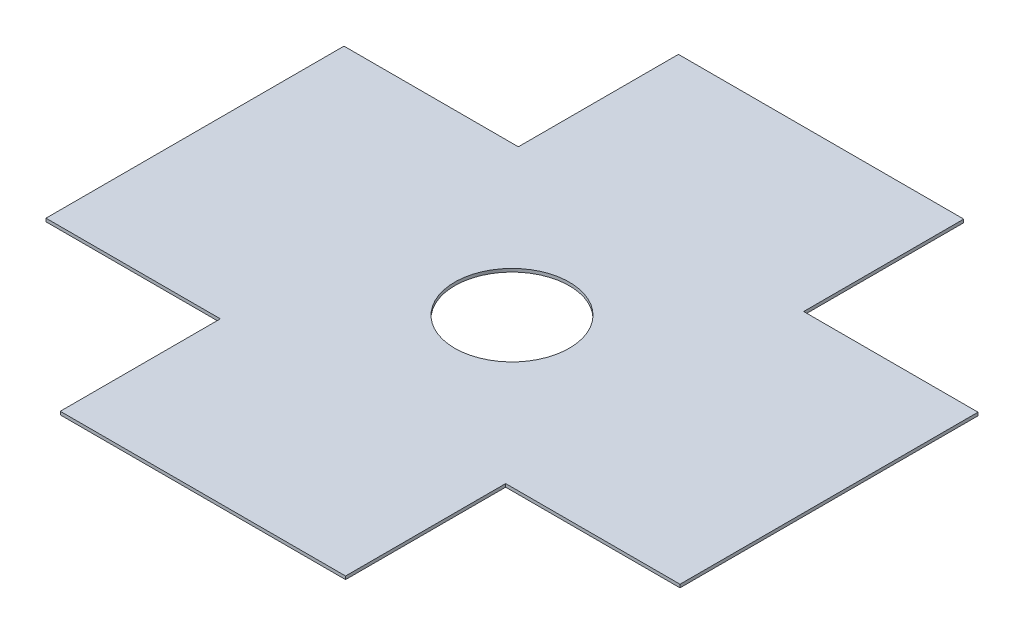
ISO-10303-21;
HEADER;
FILE_DESCRIPTION(('STEP AP214'),'2;1');
FILE_NAME('part.step','',(''),(''),'','','');
FILE_SCHEMA(('AUTOMOTIVE_DESIGN { 1 0 10303 214 1 1 1 1 }'));
ENDSEC;
DATA;
#1=APPLICATION_CONTEXT('core data for automotive mechanical design processes');
#2=APPLICATION_PROTOCOL_DEFINITION('international standard','automotive_design',2000,#1);
#3=PRODUCT_CONTEXT('',#1,'mechanical');
#4=PRODUCT('Part','Part','',(#3));
#5=PRODUCT_RELATED_PRODUCT_CATEGORY('part','',(#4));
#6=PRODUCT_DEFINITION_FORMATION('','',#4);
#7=PRODUCT_DEFINITION_CONTEXT('part definition',#1,'design');
#8=PRODUCT_DEFINITION('design','',#6,#7);
#9=PRODUCT_DEFINITION_SHAPE('','',#8);
#10=(LENGTH_UNIT() NAMED_UNIT(*) SI_UNIT(.MILLI.,.METRE.));
#11=(NAMED_UNIT(*) PLANE_ANGLE_UNIT() SI_UNIT($,.RADIAN.));
#12=(NAMED_UNIT(*) SI_UNIT($,.STERADIAN.) SOLID_ANGLE_UNIT());
#13=UNCERTAINTY_MEASURE_WITH_UNIT(LENGTH_MEASURE(1.E-05),#10,'distance_accuracy_value','');
#14=(GEOMETRIC_REPRESENTATION_CONTEXT(3) GLOBAL_UNCERTAINTY_ASSIGNED_CONTEXT((#13)) GLOBAL_UNIT_ASSIGNED_CONTEXT((#10,
#11,#12)) REPRESENTATION_CONTEXT('',''));
#15=CARTESIAN_POINT('',(0.,0.,0.));
#16=DIRECTION('',(0.,0.,1.));
#17=DIRECTION('',(1.,0.,0.));
#18=AXIS2_PLACEMENT_3D('',#15,#16,#17);
#19=CARTESIAN_POINT('',(279.299936852578,-165.,-376.420908513837));
#20=DIRECTION('',(1.,0.,0.));
#21=DIRECTION('',(0.,1.,0.));
#22=AXIS2_PLACEMENT_3D('',#19,#20,#21);
#23=PLANE('',#22);
#24=DIRECTION('',(0.,0.,1.));
#25=VECTOR('',#24,1.);
#26=CARTESIAN_POINT('',(279.299936852578,-167.,-376.420908513837));
#27=LINE('',#26,#25);
#28=CARTESIAN_POINT('',(279.299936852578,-167.,-376.420908513837));
#29=VERTEX_POINT('',#28);
#30=CARTESIAN_POINT('',(279.299936852578,-167.,-275.420908513837));
#31=VERTEX_POINT('',#30);
#32=EDGE_CURVE('E159',#29,#31,#27,.T.);
#33=ORIENTED_EDGE('',*,*,#32,.F.);
#34=DIRECTION('',(0.,-1.,0.));
#35=VECTOR('',#34,1.);
#36=CARTESIAN_POINT('',(279.299936852578,-165.,-376.420908513837));
#37=LINE('',#36,#35);
#38=CARTESIAN_POINT('',(279.299936852578,-165.,-376.420908513837));
#39=VERTEX_POINT('',#38);
#40=EDGE_CURVE('E52',#39,#29,#37,.T.);
#41=ORIENTED_EDGE('',*,*,#40,.F.);
#42=DIRECTION('',(0.,0.,1.));
#43=VECTOR('',#42,1.);
#44=CARTESIAN_POINT('',(279.299936852578,-165.,-376.420908513837));
#45=LINE('',#44,#43);
#46=CARTESIAN_POINT('',(279.299936852578,-165.,-275.420908513837));
#47=VERTEX_POINT('',#46);
#48=EDGE_CURVE('E193',#39,#47,#45,.T.);
#49=ORIENTED_EDGE('',*,*,#48,.T.);
#50=DIRECTION('',(0.,-1.,0.));
#51=VECTOR('',#50,1.);
#52=CARTESIAN_POINT('',(279.299936852578,-165.,-275.420908513837));
#53=LINE('',#52,#51);
#54=EDGE_CURVE('E105',#47,#31,#53,.T.);
#55=ORIENTED_EDGE('',*,*,#54,.T.);
#56=EDGE_LOOP('',(#33,#41,#49,#55));
#57=FACE_BOUND('',#56,.T.);
#58=ADVANCED_FACE('F36',(#57),#23,.T.);
#59=CARTESIAN_POINT('',(99.2999368525785,-165.,-376.420908513837));
#60=DIRECTION('',(0.,0.,-1.));
#61=DIRECTION('',(-1.,0.,0.));
#62=AXIS2_PLACEMENT_3D('',#59,#60,#61);
#63=PLANE('',#62);
#64=DIRECTION('',(1.,0.,0.));
#65=VECTOR('',#64,1.);
#66=CARTESIAN_POINT('',(99.2999368525785,-167.,-376.420908513837));
#67=LINE('',#66,#65);
#68=CARTESIAN_POINT('',(99.2999368525785,-167.,-376.420908513837));
#69=VERTEX_POINT('',#68);
#70=EDGE_CURVE('E190',#69,#29,#67,.T.);
#71=ORIENTED_EDGE('',*,*,#70,.F.);
#72=DIRECTION('',(0.,-1.,0.));
#73=VECTOR('',#72,1.);
#74=CARTESIAN_POINT('',(99.2999368525785,-165.,-376.420908513837));
#75=LINE('',#74,#73);
#76=CARTESIAN_POINT('',(99.2999368525785,-165.,-376.420908513837));
#77=VERTEX_POINT('',#76);
#78=EDGE_CURVE('E93',#77,#69,#75,.T.);
#79=ORIENTED_EDGE('',*,*,#78,.F.);
#80=DIRECTION('',(1.,0.,0.));
#81=VECTOR('',#80,1.);
#82=CARTESIAN_POINT('',(99.2999368525785,-165.,-376.420908513837));
#83=LINE('',#82,#81);
#84=EDGE_CURVE('E149',#77,#39,#83,.T.);
#85=ORIENTED_EDGE('',*,*,#84,.T.);
#86=ORIENTED_EDGE('',*,*,#40,.T.);
#87=EDGE_LOOP('',(#71,#79,#85,#86));
#88=FACE_BOUND('',#87,.T.);
#89=ADVANCED_FACE('F273',(#88),#63,.T.);
#90=CARTESIAN_POINT('',(99.2999368525785,-165.,-275.420908513837));
#91=DIRECTION('',(-1.,0.,0.));
#92=DIRECTION('',(0.,0.,1.));
#93=AXIS2_PLACEMENT_3D('',#90,#91,#92);
#94=PLANE('',#93);
#95=DIRECTION('',(0.,0.,-1.));
#96=VECTOR('',#95,1.);
#97=CARTESIAN_POINT('',(99.2999368525785,-167.,-275.420908513837));
#98=LINE('',#97,#96);
#99=CARTESIAN_POINT('',(99.2999368525785,-167.,-275.420908513837));
#100=VERTEX_POINT('',#99);
#101=EDGE_CURVE('E136',#100,#69,#98,.T.);
#102=ORIENTED_EDGE('',*,*,#101,.F.);
#103=DIRECTION('',(0.,-1.,0.));
#104=VECTOR('',#103,1.);
#105=CARTESIAN_POINT('',(99.2999368525785,-165.,-275.420908513837));
#106=LINE('',#105,#104);
#107=CARTESIAN_POINT('',(99.2999368525785,-165.,-275.420908513837));
#108=VERTEX_POINT('',#107);
#109=EDGE_CURVE('E131',#108,#100,#106,.T.);
#110=ORIENTED_EDGE('',*,*,#109,.F.);
#111=DIRECTION('',(0.,0.,-1.));
#112=VECTOR('',#111,1.);
#113=CARTESIAN_POINT('',(99.2999368525785,-165.,-275.420908513837));
#114=LINE('',#113,#112);
#115=EDGE_CURVE('E134',#108,#77,#114,.T.);
#116=ORIENTED_EDGE('',*,*,#115,.T.);
#117=ORIENTED_EDGE('',*,*,#78,.T.);
#118=EDGE_LOOP('',(#102,#110,#116,#117));
#119=FACE_BOUND('',#118,.T.);
#120=ADVANCED_FACE('F133',(#119),#94,.T.);
#121=CARTESIAN_POINT('',(-10.7000631474216,-165.,-275.420908513837));
#122=DIRECTION('',(0.,0.,-1.));
#123=DIRECTION('',(-1.,0.,0.));
#124=AXIS2_PLACEMENT_3D('',#121,#122,#123);
#125=PLANE('',#124);
#126=DIRECTION('',(1.,0.,0.));
#127=VECTOR('',#126,1.);
#128=CARTESIAN_POINT('',(-10.7000631474216,-167.,-275.420908513837));
#129=LINE('',#128,#127);
#130=CARTESIAN_POINT('',(-10.7000631474216,-167.,-275.420908513837));
#131=VERTEX_POINT('',#130);
#132=EDGE_CURVE('E187',#131,#100,#129,.T.);
#133=ORIENTED_EDGE('',*,*,#132,.F.);
#134=DIRECTION('',(0.,-1.,0.));
#135=VECTOR('',#134,1.);
#136=CARTESIAN_POINT('',(-10.7000631474216,-165.,-275.420908513837));
#137=LINE('',#136,#135);
#138=CARTESIAN_POINT('',(-10.7000631474216,-165.,-275.420908513837));
#139=VERTEX_POINT('',#138);
#140=EDGE_CURVE('E141',#139,#131,#137,.T.);
#141=ORIENTED_EDGE('',*,*,#140,.F.);
#142=DIRECTION('',(1.,0.,0.));
#143=VECTOR('',#142,1.);
#144=CARTESIAN_POINT('',(-10.7000631474216,-165.,-275.420908513837));
#145=LINE('',#144,#143);
#146=EDGE_CURVE('E147',#139,#108,#145,.T.);
#147=ORIENTED_EDGE('',*,*,#146,.T.);
#148=ORIENTED_EDGE('',*,*,#109,.T.);
#149=EDGE_LOOP('',(#133,#141,#147,#148));
#150=FACE_BOUND('',#149,.T.);
#151=ADVANCED_FACE('F151',(#150),#125,.T.);
#152=CARTESIAN_POINT('',(-10.7000631474216,-165.,-87.4209085138368));
#153=DIRECTION('',(-1.,0.,0.));
#154=DIRECTION('',(0.,-1.,0.));
#155=AXIS2_PLACEMENT_3D('',#152,#153,#154);
#156=PLANE('',#155);
#157=DIRECTION('',(0.,0.,-1.));
#158=VECTOR('',#157,1.);
#159=CARTESIAN_POINT('',(-10.7000631474216,-167.,-87.4209085138368));
#160=LINE('',#159,#158);
#161=CARTESIAN_POINT('',(-10.7000631474216,-167.,-87.4209085138368));
#162=VERTEX_POINT('',#161);
#163=EDGE_CURVE('E184',#162,#131,#160,.T.);
#164=ORIENTED_EDGE('',*,*,#163,.F.);
#165=DIRECTION('',(0.,-1.,0.));
#166=VECTOR('',#165,1.);
#167=CARTESIAN_POINT('',(-10.7000631474216,-165.,-87.4209085138368));
#168=LINE('',#167,#166);
#169=CARTESIAN_POINT('',(-10.7000631474216,-165.,-87.4209085138368));
#170=VERTEX_POINT('',#169);
#171=EDGE_CURVE('E198',#170,#162,#168,.T.);
#172=ORIENTED_EDGE('',*,*,#171,.F.);
#173=DIRECTION('',(0.,0.,-1.));
#174=VECTOR('',#173,1.);
#175=CARTESIAN_POINT('',(-10.7000631474216,-165.,-87.4209085138368));
#176=LINE('',#175,#174);
#177=EDGE_CURVE('E152',#170,#139,#176,.T.);
#178=ORIENTED_EDGE('',*,*,#177,.T.);
#179=ORIENTED_EDGE('',*,*,#140,.T.);
#180=EDGE_LOOP('',(#164,#172,#178,#179));
#181=FACE_BOUND('',#180,.T.);
#182=ADVANCED_FACE('F272',(#181),#156,.T.);
#183=CARTESIAN_POINT('',(99.2999368525785,-165.,-87.4209085138368));
#184=DIRECTION('',(0.,0.,1.));
#185=DIRECTION('',(1.,0.,0.));
#186=AXIS2_PLACEMENT_3D('',#183,#184,#185);
#187=PLANE('',#186);
#188=DIRECTION('',(-1.,0.,0.));
#189=VECTOR('',#188,1.);
#190=CARTESIAN_POINT('',(99.2999368525785,-167.,-87.4209085138368));
#191=LINE('',#190,#189);
#192=CARTESIAN_POINT('',(99.2999368525785,-167.,-87.4209085138368));
#193=VERTEX_POINT('',#192);
#194=EDGE_CURVE('E181',#193,#162,#191,.T.);
#195=ORIENTED_EDGE('',*,*,#194,.F.);
#196=DIRECTION('',(0.,-1.,0.));
#197=VECTOR('',#196,1.);
#198=CARTESIAN_POINT('',(99.2999368525785,-165.,-87.4209085138368));
#199=LINE('',#198,#197);
#200=CARTESIAN_POINT('',(99.2999368525785,-165.,-87.4209085138368));
#201=VERTEX_POINT('',#200);
#202=EDGE_CURVE('E200',#201,#193,#199,.T.);
#203=ORIENTED_EDGE('',*,*,#202,.F.);
#204=DIRECTION('',(-1.,0.,0.));
#205=VECTOR('',#204,1.);
#206=CARTESIAN_POINT('',(99.2999368525785,-165.,-87.4209085138368));
#207=LINE('',#206,#205);
#208=EDGE_CURVE('E154',#201,#170,#207,.T.);
#209=ORIENTED_EDGE('',*,*,#208,.T.);
#210=ORIENTED_EDGE('',*,*,#171,.T.);
#211=EDGE_LOOP('',(#195,#203,#209,#210));
#212=FACE_BOUND('',#211,.T.);
#213=ADVANCED_FACE('F269',(#212),#187,.T.);
#214=CARTESIAN_POINT('',(99.2999368525784,-165.,13.5790914861632));
#215=DIRECTION('',(-1.,0.,0.));
#216=DIRECTION('',(0.,0.,1.));
#217=AXIS2_PLACEMENT_3D('',#214,#215,#216);
#218=PLANE('',#217);
#219=DIRECTION('',(0.,0.,-1.));
#220=VECTOR('',#219,1.);
#221=CARTESIAN_POINT('',(99.2999368525784,-167.,13.5790914861632));
#222=LINE('',#221,#220);
#223=CARTESIAN_POINT('',(99.2999368525784,-167.,13.5790914861632));
#224=VERTEX_POINT('',#223);
#225=EDGE_CURVE('E178',#224,#193,#222,.T.);
#226=ORIENTED_EDGE('',*,*,#225,.F.);
#227=DIRECTION('',(0.,-1.,0.));
#228=VECTOR('',#227,1.);
#229=CARTESIAN_POINT('',(99.2999368525784,-165.,13.5790914861632));
#230=LINE('',#229,#228);
#231=CARTESIAN_POINT('',(99.2999368525784,-165.,13.5790914861632));
#232=VERTEX_POINT('',#231);
#233=EDGE_CURVE('E202',#232,#224,#230,.T.);
#234=ORIENTED_EDGE('',*,*,#233,.F.);
#235=DIRECTION('',(0.,0.,-1.));
#236=VECTOR('',#235,1.);
#237=CARTESIAN_POINT('',(99.2999368525784,-165.,13.5790914861632));
#238=LINE('',#237,#236);
#239=EDGE_CURVE('E265',#232,#201,#238,.T.);
#240=ORIENTED_EDGE('',*,*,#239,.T.);
#241=ORIENTED_EDGE('',*,*,#202,.T.);
#242=EDGE_LOOP('',(#226,#234,#240,#241));
#243=FACE_BOUND('',#242,.T.);
#244=ADVANCED_FACE('F262',(#243),#218,.T.);
#245=CARTESIAN_POINT('',(279.299936852578,-165.,13.5790914861632));
#246=DIRECTION('',(0.,0.,1.));
#247=DIRECTION('',(1.,0.,0.));
#248=AXIS2_PLACEMENT_3D('',#245,#246,#247);
#249=PLANE('',#248);
#250=DIRECTION('',(-1.,0.,0.));
#251=VECTOR('',#250,1.);
#252=CARTESIAN_POINT('',(279.299936852578,-167.,13.5790914861632));
#253=LINE('',#252,#251);
#254=CARTESIAN_POINT('',(279.299936852578,-167.,13.5790914861632));
#255=VERTEX_POINT('',#254);
#256=EDGE_CURVE('E175',#255,#224,#253,.T.);
#257=ORIENTED_EDGE('',*,*,#256,.F.);
#258=DIRECTION('',(0.,-1.,0.));
#259=VECTOR('',#258,1.);
#260=CARTESIAN_POINT('',(279.299936852578,-165.,13.5790914861632));
#261=LINE('',#260,#259);
#262=CARTESIAN_POINT('',(279.299936852578,-165.,13.5790914861632));
#263=VERTEX_POINT('',#262);
#264=EDGE_CURVE('E204',#263,#255,#261,.T.);
#265=ORIENTED_EDGE('',*,*,#264,.F.);
#266=DIRECTION('',(-1.,0.,0.));
#267=VECTOR('',#266,1.);
#268=CARTESIAN_POINT('',(279.299936852578,-165.,13.5790914861632));
#269=LINE('',#268,#267);
#270=EDGE_CURVE('E366',#263,#232,#269,.T.);
#271=ORIENTED_EDGE('',*,*,#270,.T.);
#272=ORIENTED_EDGE('',*,*,#233,.T.);
#273=EDGE_LOOP('',(#257,#265,#271,#272));
#274=FACE_BOUND('',#273,.T.);
#275=ADVANCED_FACE('F258',(#274),#249,.T.);
#276=CARTESIAN_POINT('',(279.299936852578,-165.,-87.4209085138368));
#277=DIRECTION('',(1.,0.,0.));
#278=DIRECTION('',(0.,0.,-1.));
#279=AXIS2_PLACEMENT_3D('',#276,#277,#278);
#280=PLANE('',#279);
#281=DIRECTION('',(0.,0.,1.));
#282=VECTOR('',#281,1.);
#283=CARTESIAN_POINT('',(279.299936852578,-167.,-87.4209085138368));
#284=LINE('',#283,#282);
#285=CARTESIAN_POINT('',(279.299936852578,-167.,-87.4209085138368));
#286=VERTEX_POINT('',#285);
#287=EDGE_CURVE('E172',#286,#255,#284,.T.);
#288=ORIENTED_EDGE('',*,*,#287,.F.);
#289=DIRECTION('',(0.,-1.,0.));
#290=VECTOR('',#289,1.);
#291=CARTESIAN_POINT('',(279.299936852578,-165.,-87.4209085138368));
#292=LINE('',#291,#290);
#293=CARTESIAN_POINT('',(279.299936852578,-165.,-87.4209085138368));
#294=VERTEX_POINT('',#293);
#295=EDGE_CURVE('E206',#294,#286,#292,.T.);
#296=ORIENTED_EDGE('',*,*,#295,.F.);
#297=DIRECTION('',(0.,0.,1.));
#298=VECTOR('',#297,1.);
#299=CARTESIAN_POINT('',(279.299936852578,-165.,-87.4209085138368));
#300=LINE('',#299,#298);
#301=EDGE_CURVE('E254',#294,#263,#300,.T.);
#302=ORIENTED_EDGE('',*,*,#301,.T.);
#303=ORIENTED_EDGE('',*,*,#264,.T.);
#304=EDGE_LOOP('',(#288,#296,#302,#303));
#305=FACE_BOUND('',#304,.T.);
#306=ADVANCED_FACE('F252',(#305),#280,.T.);
#307=CARTESIAN_POINT('',(389.299936852578,-165.,-87.4209085138368));
#308=DIRECTION('',(0.,0.,1.));
#309=DIRECTION('',(1.,0.,0.));
#310=AXIS2_PLACEMENT_3D('',#307,#308,#309);
#311=PLANE('',#310);
#312=DIRECTION('',(-1.,0.,0.));
#313=VECTOR('',#312,1.);
#314=CARTESIAN_POINT('',(389.299936852578,-167.,-87.4209085138368));
#315=LINE('',#314,#313);
#316=CARTESIAN_POINT('',(389.299936852578,-167.,-87.4209085138368));
#317=VERTEX_POINT('',#316);
#318=EDGE_CURVE('E169',#317,#286,#315,.T.);
#319=ORIENTED_EDGE('',*,*,#318,.F.);
#320=DIRECTION('',(0.,-1.,0.));
#321=VECTOR('',#320,1.);
#322=CARTESIAN_POINT('',(389.299936852578,-165.,-87.4209085138368));
#323=LINE('',#322,#321);
#324=CARTESIAN_POINT('',(389.299936852578,-165.,-87.4209085138368));
#325=VERTEX_POINT('',#324);
#326=EDGE_CURVE('E208',#325,#317,#323,.T.);
#327=ORIENTED_EDGE('',*,*,#326,.F.);
#328=DIRECTION('',(-1.,0.,0.));
#329=VECTOR('',#328,1.);
#330=CARTESIAN_POINT('',(389.299936852578,-165.,-87.4209085138368));
#331=LINE('',#330,#329);
#332=EDGE_CURVE('E248',#325,#294,#331,.T.);
#333=ORIENTED_EDGE('',*,*,#332,.T.);
#334=ORIENTED_EDGE('',*,*,#295,.T.);
#335=EDGE_LOOP('',(#319,#327,#333,#334));
#336=FACE_BOUND('',#335,.T.);
#337=ADVANCED_FACE('F245',(#336),#311,.T.);
#338=CARTESIAN_POINT('',(389.299936852578,-165.,-275.420908513837));
#339=DIRECTION('',(1.,0.,0.));
#340=DIRECTION('',(0.,0.,-1.));
#341=AXIS2_PLACEMENT_3D('',#338,#339,#340);
#342=PLANE('',#341);
#343=DIRECTION('',(0.,0.,1.));
#344=VECTOR('',#343,1.);
#345=CARTESIAN_POINT('',(389.299936852578,-167.,-275.420908513837));
#346=LINE('',#345,#344);
#347=CARTESIAN_POINT('',(389.299936852578,-167.,-275.420908513837));
#348=VERTEX_POINT('',#347);
#349=EDGE_CURVE('E166',#348,#317,#346,.T.);
#350=ORIENTED_EDGE('',*,*,#349,.F.);
#351=DIRECTION('',(0.,-1.,0.));
#352=VECTOR('',#351,1.);
#353=CARTESIAN_POINT('',(389.299936852578,-165.,-275.420908513837));
#354=LINE('',#353,#352);
#355=CARTESIAN_POINT('',(389.299936852578,-165.,-275.420908513837));
#356=VERTEX_POINT('',#355);
#357=EDGE_CURVE('E210',#356,#348,#354,.T.);
#358=ORIENTED_EDGE('',*,*,#357,.F.);
#359=DIRECTION('',(0.,0.,1.));
#360=VECTOR('',#359,1.);
#361=CARTESIAN_POINT('',(389.299936852578,-165.,-275.420908513837));
#362=LINE('',#361,#360);
#363=EDGE_CURVE('E362',#356,#325,#362,.T.);
#364=ORIENTED_EDGE('',*,*,#363,.T.);
#365=ORIENTED_EDGE('',*,*,#326,.T.);
#366=EDGE_LOOP('',(#350,#358,#364,#365));
#367=FACE_BOUND('',#366,.T.);
#368=ADVANCED_FACE('F241',(#367),#342,.T.);
#369=CARTESIAN_POINT('',(279.299936852578,-165.,-275.420908513837));
#370=DIRECTION('',(0.,0.,-1.));
#371=DIRECTION('',(-1.,0.,0.));
#372=AXIS2_PLACEMENT_3D('',#369,#370,#371);
#373=PLANE('',#372);
#374=DIRECTION('',(1.,0.,0.));
#375=VECTOR('',#374,1.);
#376=CARTESIAN_POINT('',(279.299936852578,-167.,-275.420908513837));
#377=LINE('',#376,#375);
#378=EDGE_CURVE('E162',#31,#348,#377,.T.);
#379=ORIENTED_EDGE('',*,*,#378,.F.);
#380=ORIENTED_EDGE('',*,*,#54,.F.);
#381=DIRECTION('',(1.,0.,0.));
#382=VECTOR('',#381,1.);
#383=CARTESIAN_POINT('',(279.299936852578,-165.,-275.420908513837));
#384=LINE('',#383,#382);
#385=EDGE_CURVE('E237',#47,#356,#384,.T.);
#386=ORIENTED_EDGE('',*,*,#385,.T.);
#387=ORIENTED_EDGE('',*,*,#357,.T.);
#388=EDGE_LOOP('',(#379,#380,#386,#387));
#389=FACE_BOUND('',#388,.T.);
#390=ADVANCED_FACE('F235',(#389),#373,.T.);
#391=CARTESIAN_POINT('',(0.,-165.,0.));
#392=DIRECTION('',(0.,1.,0.));
#393=DIRECTION('',(0.,0.,1.));
#394=AXIS2_PLACEMENT_3D('',#391,#392,#393);
#395=PLANE('',#394);
#396=CARTESIAN_POINT('',(189.299936852578,-165.,-181.420908513837));
#397=DIRECTION('',(0.,1.,0.));
#398=DIRECTION('',(0.,0.,1.));
#399=AXIS2_PLACEMENT_3D('',#396,#397,#398);
#400=CIRCLE('',#399,36.15);
#401=CARTESIAN_POINT('',(189.299936852578,-165.,-145.270908513837));
#402=VERTEX_POINT('',#401);
#403=EDGE_CURVE('E356',#402,#402,#400,.T.);
#404=ORIENTED_EDGE('',*,*,#403,.F.);
#405=EDGE_LOOP('',(#404));
#406=FACE_BOUND('',#405,.T.);
#407=ORIENTED_EDGE('',*,*,#48,.F.);
#408=ORIENTED_EDGE('',*,*,#84,.F.);
#409=ORIENTED_EDGE('',*,*,#115,.F.);
#410=ORIENTED_EDGE('',*,*,#146,.F.);
#411=ORIENTED_EDGE('',*,*,#177,.F.);
#412=ORIENTED_EDGE('',*,*,#208,.F.);
#413=ORIENTED_EDGE('',*,*,#239,.F.);
#414=ORIENTED_EDGE('',*,*,#270,.F.);
#415=ORIENTED_EDGE('',*,*,#301,.F.);
#416=ORIENTED_EDGE('',*,*,#332,.F.);
#417=ORIENTED_EDGE('',*,*,#363,.F.);
#418=ORIENTED_EDGE('',*,*,#385,.F.);
#419=EDGE_LOOP('',(#407,#408,#409,#410,#411,#412,#413,#414,#415,#416,#417,#418));
#420=FACE_BOUND('',#419,.T.);
#421=ADVANCED_FACE('F145',(#406,#420),#395,.T.);
#422=CARTESIAN_POINT('',(0.,-167.,0.));
#423=DIRECTION('',(0.,1.,0.));
#424=DIRECTION('',(0.,0.,1.));
#425=AXIS2_PLACEMENT_3D('',#422,#423,#424);
#426=PLANE('',#425);
#427=CARTESIAN_POINT('',(99.2999368525784,-167.,-251.889303012295));
#428=DIRECTION('',(0.,1.,0.));
#429=DIRECTION('',(0.,0.,1.));
#430=AXIS2_PLACEMENT_3D('',#427,#428,#429);
#431=CIRCLE('',#430,9.99999999999998);
#432=CARTESIAN_POINT('',(99.2999368525784,-167.,-241.889303012295));
#433=VERTEX_POINT('',#432);
#434=EDGE_CURVE('E11',#433,#433,#431,.F.);
#435=ORIENTED_EDGE('',*,*,#434,.F.);
#436=EDGE_LOOP('',(#435));
#437=FACE_BOUND('',#436,.T.);
#438=CARTESIAN_POINT('',(279.299936852578,-167.,-253.200342909941));
#439=DIRECTION('',(0.,1.,0.));
#440=DIRECTION('',(0.,0.,1.));
#441=AXIS2_PLACEMENT_3D('',#438,#439,#440);
#442=CIRCLE('',#441,10.);
#443=CARTESIAN_POINT('',(279.299936852578,-167.,-243.200342909941));
#444=VERTEX_POINT('',#443);
#445=EDGE_CURVE('E44',#444,#444,#442,.F.);
#446=ORIENTED_EDGE('',*,*,#445,.F.);
#447=EDGE_LOOP('',(#446));
#448=FACE_BOUND('',#447,.T.);
#449=CARTESIAN_POINT('',(279.299936852578,-167.,-109.641474117733));
#450=DIRECTION('',(0.,1.,0.));
#451=DIRECTION('',(0.,0.,1.));
#452=AXIS2_PLACEMENT_3D('',#449,#450,#451);
#453=CIRCLE('',#452,9.99999999999998);
#454=CARTESIAN_POINT('',(279.299936852578,-167.,-99.641474117733));
#455=VERTEX_POINT('',#454);
#456=EDGE_CURVE('E215',#455,#455,#453,.F.);
#457=ORIENTED_EDGE('',*,*,#456,.F.);
#458=EDGE_LOOP('',(#457));
#459=FACE_BOUND('',#458,.T.);
#460=CARTESIAN_POINT('',(99.2999368525784,-167.,-110.952514015379));
#461=DIRECTION('',(0.,1.,0.));
#462=DIRECTION('',(0.,0.,1.));
#463=AXIS2_PLACEMENT_3D('',#460,#461,#462);
#464=CIRCLE('',#463,9.99999999999999);
#465=CARTESIAN_POINT('',(99.2999368525784,-167.,-100.952514015379));
#466=VERTEX_POINT('',#465);
#467=EDGE_CURVE('E195',#466,#466,#464,.F.);
#468=ORIENTED_EDGE('',*,*,#467,.F.);
#469=EDGE_LOOP('',(#468));
#470=FACE_BOUND('',#469,.T.);
#471=CARTESIAN_POINT('',(189.299936852578,-167.,-181.420908513837));
#472=DIRECTION('',(0.,1.,0.));
#473=DIRECTION('',(0.,0.,1.));
#474=AXIS2_PLACEMENT_3D('',#471,#472,#473);
#475=CIRCLE('',#474,36.15);
#476=CARTESIAN_POINT('',(189.299936852578,-167.,-145.270908513837));
#477=VERTEX_POINT('',#476);
#478=EDGE_CURVE('E163',#477,#477,#475,.T.);
#479=ORIENTED_EDGE('',*,*,#478,.T.);
#480=EDGE_LOOP('',(#479));
#481=FACE_BOUND('',#480,.T.);
#482=ORIENTED_EDGE('',*,*,#32,.T.);
#483=ORIENTED_EDGE('',*,*,#378,.T.);
#484=ORIENTED_EDGE('',*,*,#349,.T.);
#485=ORIENTED_EDGE('',*,*,#318,.T.);
#486=ORIENTED_EDGE('',*,*,#287,.T.);
#487=ORIENTED_EDGE('',*,*,#256,.T.);
#488=ORIENTED_EDGE('',*,*,#225,.T.);
#489=ORIENTED_EDGE('',*,*,#194,.T.);
#490=ORIENTED_EDGE('',*,*,#163,.T.);
#491=ORIENTED_EDGE('',*,*,#132,.T.);
#492=ORIENTED_EDGE('',*,*,#101,.T.);
#493=ORIENTED_EDGE('',*,*,#70,.T.);
#494=EDGE_LOOP('',(#482,#483,#484,#485,#486,#487,#488,#489,#490,#491,#492,#493));
#495=FACE_BOUND('',#494,.T.);
#496=ADVANCED_FACE('F222',(#437,#448,#459,#470,#481,#495),#426,.F.);
#497=CARTESIAN_POINT('',(189.299936852578,-167.,-181.420908513837));
#498=DIRECTION('',(0.,1.,0.));
#499=DIRECTION('',(0.,0.,1.));
#500=AXIS2_PLACEMENT_3D('',#497,#498,#499);
#501=CYLINDRICAL_SURFACE('',#500,36.15);
#502=ORIENTED_EDGE('',*,*,#478,.F.);
#503=EDGE_LOOP('',(#502));
#504=FACE_BOUND('',#503,.T.);
#505=ORIENTED_EDGE('',*,*,#403,.T.);
#506=EDGE_LOOP('',(#505));
#507=FACE_BOUND('',#506,.T.);
#508=ADVANCED_FACE('F225',(#504,#507),#501,.F.);
#509=CARTESIAN_POINT('',(99.2999368525784,-177.,-110.952514015379));
#510=DIRECTION('',(0.,1.,0.));
#511=DIRECTION('',(0.,0.,1.));
#512=AXIS2_PLACEMENT_3D('',#509,#510,#511);
#513=CYLINDRICAL_SURFACE('',#512,9.99999999999999);
#514=CARTESIAN_POINT('',(99.2999368525784,-177.,-110.952514015379));
#515=DIRECTION('',(0.,-1.,0.));
#516=DIRECTION('',(0.,0.,-1.));
#517=AXIS2_PLACEMENT_3D('',#514,#515,#516);
#518=CIRCLE('',#517,9.99999999999999);
#519=CARTESIAN_POINT('',(99.2999368525784,-177.,-120.952514015379));
#520=VERTEX_POINT('',#519);
#521=EDGE_CURVE('E353',#520,#520,#518,.T.);
#522=ORIENTED_EDGE('',*,*,#521,.F.);
#523=EDGE_LOOP('',(#522));
#524=FACE_BOUND('',#523,.T.);
#525=ORIENTED_EDGE('',*,*,#467,.T.);
#526=EDGE_LOOP('',(#525));
#527=FACE_BOUND('',#526,.T.);
#528=ADVANCED_FACE('F309',(#524,#527),#513,.T.);
#529=CARTESIAN_POINT('',(99.2999368525784,-177.,-110.952514015379));
#530=DIRECTION('',(0.,-1.,0.));
#531=DIRECTION('',(0.,0.,-1.));
#532=AXIS2_PLACEMENT_3D('',#529,#530,#531);
#533=PLANE('',#532);
#534=ORIENTED_EDGE('',*,*,#521,.T.);
#535=EDGE_LOOP('',(#534));
#536=FACE_BOUND('',#535,.T.);
#537=ADVANCED_FACE('F313',(#536),#533,.T.);
#538=CARTESIAN_POINT('',(279.299936852578,-177.,-109.641474117733));
#539=DIRECTION('',(0.,1.,0.));
#540=DIRECTION('',(0.,0.,1.));
#541=AXIS2_PLACEMENT_3D('',#538,#539,#540);
#542=CYLINDRICAL_SURFACE('',#541,9.99999999999998);
#543=CARTESIAN_POINT('',(279.299936852578,-177.,-109.641474117733));
#544=DIRECTION('',(0.,-1.,0.));
#545=DIRECTION('',(0.,0.,-1.));
#546=AXIS2_PLACEMENT_3D('',#543,#544,#545);
#547=CIRCLE('',#546,9.99999999999998);
#548=CARTESIAN_POINT('',(279.299936852578,-177.,-119.641474117733));
#549=VERTEX_POINT('',#548);
#550=EDGE_CURVE('E348',#549,#549,#547,.T.);
#551=ORIENTED_EDGE('',*,*,#550,.F.);
#552=EDGE_LOOP('',(#551));
#553=FACE_BOUND('',#552,.T.);
#554=ORIENTED_EDGE('',*,*,#456,.T.);
#555=EDGE_LOOP('',(#554));
#556=FACE_BOUND('',#555,.T.);
#557=ADVANCED_FACE('F317',(#553,#556),#542,.T.);
#558=CARTESIAN_POINT('',(279.299936852578,-177.,-109.641474117733));
#559=DIRECTION('',(0.,-1.,0.));
#560=DIRECTION('',(0.,0.,-1.));
#561=AXIS2_PLACEMENT_3D('',#558,#559,#560);
#562=PLANE('',#561);
#563=ORIENTED_EDGE('',*,*,#550,.T.);
#564=EDGE_LOOP('',(#563));
#565=FACE_BOUND('',#564,.T.);
#566=ADVANCED_FACE('F321',(#565),#562,.T.);
#567=CARTESIAN_POINT('',(279.299936852578,-177.,-253.200342909941));
#568=DIRECTION('',(0.,1.,0.));
#569=DIRECTION('',(0.,0.,1.));
#570=AXIS2_PLACEMENT_3D('',#567,#568,#569);
#571=CYLINDRICAL_SURFACE('',#570,10.);
#572=CARTESIAN_POINT('',(279.299936852578,-177.,-253.200342909941));
#573=DIRECTION('',(0.,-1.,0.));
#574=DIRECTION('',(0.,0.,1.));
#575=AXIS2_PLACEMENT_3D('',#572,#573,#574);
#576=CIRCLE('',#575,10.);
#577=CARTESIAN_POINT('',(279.299936852578,-177.,-243.200342909941));
#578=VERTEX_POINT('',#577);
#579=EDGE_CURVE('E345',#578,#578,#576,.T.);
#580=ORIENTED_EDGE('',*,*,#579,.F.);
#581=EDGE_LOOP('',(#580));
#582=FACE_BOUND('',#581,.T.);
#583=ORIENTED_EDGE('',*,*,#445,.T.);
#584=EDGE_LOOP('',(#583));
#585=FACE_BOUND('',#584,.T.);
#586=ADVANCED_FACE('F220',(#582,#585),#571,.T.);
#587=CARTESIAN_POINT('',(279.299936852578,-177.,-253.200342909941));
#588=DIRECTION('',(0.,1.,0.));
#589=DIRECTION('',(0.,0.,1.));
#590=AXIS2_PLACEMENT_3D('',#587,#588,#589);
#591=PLANE('',#590);
#592=ORIENTED_EDGE('',*,*,#579,.T.);
#593=EDGE_LOOP('',(#592));
#594=FACE_BOUND('',#593,.T.);
#595=ADVANCED_FACE('F328',(#594),#591,.F.);
#596=CARTESIAN_POINT('',(99.2999368525784,-177.,-251.889303012295));
#597=DIRECTION('',(0.,1.,0.));
#598=DIRECTION('',(0.,0.,1.));
#599=AXIS2_PLACEMENT_3D('',#596,#597,#598);
#600=CYLINDRICAL_SURFACE('',#599,9.99999999999998);
#601=CARTESIAN_POINT('',(99.2999368525784,-177.,-251.889303012295));
#602=DIRECTION('',(0.,-1.,0.));
#603=DIRECTION('',(0.,0.,1.));
#604=AXIS2_PLACEMENT_3D('',#601,#602,#603);
#605=CIRCLE('',#604,9.99999999999998);
#606=CARTESIAN_POINT('',(99.2999368525784,-177.,-241.889303012295));
#607=VERTEX_POINT('',#606);
#608=EDGE_CURVE('E344',#607,#607,#605,.T.);
#609=ORIENTED_EDGE('',*,*,#608,.F.);
#610=EDGE_LOOP('',(#609));
#611=FACE_BOUND('',#610,.T.);
#612=ORIENTED_EDGE('',*,*,#434,.T.);
#613=EDGE_LOOP('',(#612));
#614=FACE_BOUND('',#613,.T.);
#615=ADVANCED_FACE('F332',(#611,#614),#600,.T.);
#616=CARTESIAN_POINT('',(99.2999368525784,-177.,-251.889303012295));
#617=DIRECTION('',(0.,1.,0.));
#618=DIRECTION('',(0.,0.,1.));
#619=AXIS2_PLACEMENT_3D('',#616,#617,#618);
#620=PLANE('',#619);
#621=ORIENTED_EDGE('',*,*,#608,.T.);
#622=EDGE_LOOP('',(#621));
#623=FACE_BOUND('',#622,.T.);
#624=ADVANCED_FACE('F336',(#623),#620,.F.);
#625=CLOSED_SHELL('',(#58,#89,#120,#151,#182,#213,#244,#275,#306,#337,#368,#390,#421,#496,#508,
#528,#537,#557,#566,#586,#595,#615,#624));
#626=MANIFOLD_SOLID_BREP('B2',#625);
#627=ADVANCED_BREP_SHAPE_REPRESENTATION('',(#18,#626),#14);
#628=SHAPE_DEFINITION_REPRESENTATION(#9,#627);
ENDSEC;
END-ISO-10303-21;
